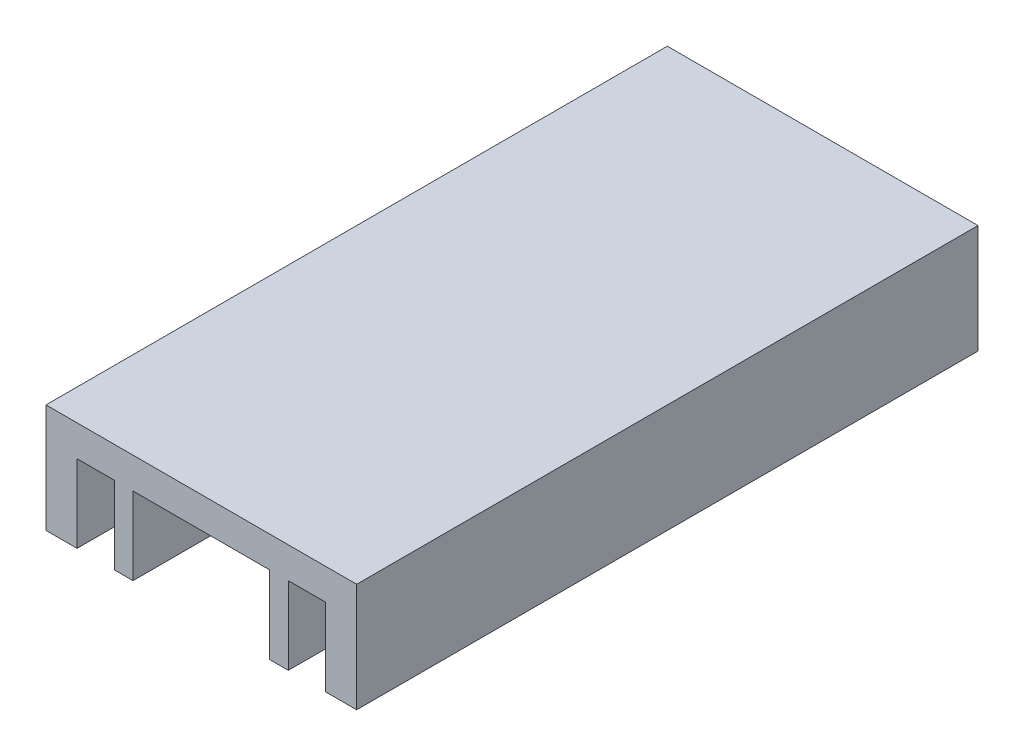
ISO-10303-21;
HEADER;
FILE_DESCRIPTION(('STEP AP214'),'2;1');
FILE_NAME('part.step','',(''),(''),'','','');
FILE_SCHEMA(('AUTOMOTIVE_DESIGN { 1 0 10303 214 1 1 1 1 }'));
ENDSEC;
DATA;
#1=APPLICATION_CONTEXT('core data for automotive mechanical design processes');
#2=APPLICATION_PROTOCOL_DEFINITION('international standard','automotive_design',2000,#1);
#3=PRODUCT_CONTEXT('',#1,'mechanical');
#4=PRODUCT('Part','Part','',(#3));
#5=PRODUCT_RELATED_PRODUCT_CATEGORY('part','',(#4));
#6=PRODUCT_DEFINITION_FORMATION('','',#4);
#7=PRODUCT_DEFINITION_CONTEXT('part definition',#1,'design');
#8=PRODUCT_DEFINITION('design','',#6,#7);
#9=PRODUCT_DEFINITION_SHAPE('','',#8);
#10=(LENGTH_UNIT() NAMED_UNIT(*) SI_UNIT(.MILLI.,.METRE.));
#11=(NAMED_UNIT(*) PLANE_ANGLE_UNIT() SI_UNIT($,.RADIAN.));
#12=(NAMED_UNIT(*) SI_UNIT($,.STERADIAN.) SOLID_ANGLE_UNIT());
#13=UNCERTAINTY_MEASURE_WITH_UNIT(LENGTH_MEASURE(1.E-05),#10,'distance_accuracy_value','');
#14=(GEOMETRIC_REPRESENTATION_CONTEXT(3) GLOBAL_UNCERTAINTY_ASSIGNED_CONTEXT((#13)) GLOBAL_UNIT_ASSIGNED_CONTEXT((#10,
#11,#12)) REPRESENTATION_CONTEXT('',''));
#15=CARTESIAN_POINT('',(0.,0.,0.));
#16=DIRECTION('',(0.,0.,1.));
#17=DIRECTION('',(1.,0.,0.));
#18=AXIS2_PLACEMENT_3D('',#15,#16,#17);
#19=CARTESIAN_POINT('',(-3.,6.5,20.));
#20=DIRECTION('',(-1.,0.,0.));
#21=DIRECTION('',(0.,0.,1.));
#22=AXIS2_PLACEMENT_3D('',#19,#20,#21);
#23=PLANE('',#22);
#24=DIRECTION('',(0.,1.,0.));
#25=VECTOR('',#24,1.);
#26=CARTESIAN_POINT('',(-3.,6.5,0.));
#27=LINE('',#26,#25);
#28=CARTESIAN_POINT('',(-3.,6.5,0.));
#29=VERTEX_POINT('',#28);
#30=CARTESIAN_POINT('',(-3.,9.,0.));
#31=VERTEX_POINT('',#30);
#32=EDGE_CURVE('E181',#29,#31,#27,.T.);
#33=ORIENTED_EDGE('',*,*,#32,.T.);
#34=DIRECTION('',(0.,0.,-1.));
#35=VECTOR('',#34,1.);
#36=CARTESIAN_POINT('',(-3.,9.,20.));
#37=LINE('',#36,#35);
#38=CARTESIAN_POINT('',(-3.,9.,20.));
#39=VERTEX_POINT('',#38);
#40=EDGE_CURVE('E11',#39,#31,#37,.T.);
#41=ORIENTED_EDGE('',*,*,#40,.F.);
#42=DIRECTION('',(0.,1.,0.));
#43=VECTOR('',#42,1.);
#44=CARTESIAN_POINT('',(-3.,6.5,20.));
#45=LINE('',#44,#43);
#46=CARTESIAN_POINT('',(-3.,6.5,20.));
#47=VERTEX_POINT('',#46);
#48=EDGE_CURVE('E211',#47,#39,#45,.T.);
#49=ORIENTED_EDGE('',*,*,#48,.F.);
#50=DIRECTION('',(0.,0.,-1.));
#51=VECTOR('',#50,1.);
#52=CARTESIAN_POINT('',(-3.,6.5,20.));
#53=LINE('',#52,#51);
#54=EDGE_CURVE('E177',#47,#29,#53,.T.);
#55=ORIENTED_EDGE('',*,*,#54,.T.);
#56=EDGE_LOOP('',(#33,#41,#49,#55));
#57=FACE_BOUND('',#56,.T.);
#58=ADVANCED_FACE('F37',(#57),#23,.F.);
#59=CARTESIAN_POINT('',(-3.,9.,20.));
#60=DIRECTION('',(0.,1.,0.));
#61=DIRECTION('',(0.,0.,1.));
#62=AXIS2_PLACEMENT_3D('',#59,#60,#61);
#63=PLANE('',#62);
#64=DIRECTION('',(1.,0.,0.));
#65=VECTOR('',#64,1.);
#66=CARTESIAN_POINT('',(-3.,9.,0.));
#67=LINE('',#66,#65);
#68=CARTESIAN_POINT('',(-1.8,9.,0.));
#69=VERTEX_POINT('',#68);
#70=EDGE_CURVE('E184',#31,#69,#67,.T.);
#71=ORIENTED_EDGE('',*,*,#70,.T.);
#72=DIRECTION('',(0.,0.,-1.));
#73=VECTOR('',#72,1.);
#74=CARTESIAN_POINT('',(-1.8,9.,20.));
#75=LINE('',#74,#73);
#76=CARTESIAN_POINT('',(-1.8,9.,20.));
#77=VERTEX_POINT('',#76);
#78=EDGE_CURVE('E45',#77,#69,#75,.T.);
#79=ORIENTED_EDGE('',*,*,#78,.F.);
#80=DIRECTION('',(1.,0.,0.));
#81=VECTOR('',#80,1.);
#82=CARTESIAN_POINT('',(-3.,9.,20.));
#83=LINE('',#82,#81);
#84=EDGE_CURVE('E120',#39,#77,#83,.T.);
#85=ORIENTED_EDGE('',*,*,#84,.F.);
#86=ORIENTED_EDGE('',*,*,#40,.T.);
#87=EDGE_LOOP('',(#71,#79,#85,#86));
#88=FACE_BOUND('',#87,.T.);
#89=ADVANCED_FACE('F309',(#88),#63,.F.);
#90=CARTESIAN_POINT('',(-1.8,9.,20.));
#91=DIRECTION('',(1.,0.,0.));
#92=DIRECTION('',(0.,1.,0.));
#93=AXIS2_PLACEMENT_3D('',#90,#91,#92);
#94=PLANE('',#93);
#95=DIRECTION('',(0.,-1.,0.));
#96=VECTOR('',#95,1.);
#97=CARTESIAN_POINT('',(-1.8,9.,0.));
#98=LINE('',#97,#96);
#99=CARTESIAN_POINT('',(-1.8,6.5,0.));
#100=VERTEX_POINT('',#99);
#101=EDGE_CURVE('E186',#69,#100,#98,.T.);
#102=ORIENTED_EDGE('',*,*,#101,.T.);
#103=DIRECTION('',(0.,0.,-1.));
#104=VECTOR('',#103,1.);
#105=CARTESIAN_POINT('',(-1.8,6.5,20.));
#106=LINE('',#105,#104);
#107=CARTESIAN_POINT('',(-1.8,6.5,20.));
#108=VERTEX_POINT('',#107);
#109=EDGE_CURVE('E242',#108,#100,#106,.T.);
#110=ORIENTED_EDGE('',*,*,#109,.F.);
#111=DIRECTION('',(0.,-1.,0.));
#112=VECTOR('',#111,1.);
#113=CARTESIAN_POINT('',(-1.8,9.,20.));
#114=LINE('',#113,#112);
#115=EDGE_CURVE('E250',#77,#108,#114,.T.);
#116=ORIENTED_EDGE('',*,*,#115,.F.);
#117=ORIENTED_EDGE('',*,*,#78,.T.);
#118=EDGE_LOOP('',(#102,#110,#116,#117));
#119=FACE_BOUND('',#118,.T.);
#120=ADVANCED_FACE('F248',(#119),#94,.F.);
#121=CARTESIAN_POINT('',(-1.8,6.5,20.));
#122=DIRECTION('',(0.,1.,0.));
#123=DIRECTION('',(0.,0.,1.));
#124=AXIS2_PLACEMENT_3D('',#121,#122,#123);
#125=PLANE('',#124);
#126=DIRECTION('',(1.,0.,0.));
#127=VECTOR('',#126,1.);
#128=CARTESIAN_POINT('',(-1.8,6.5,0.));
#129=LINE('',#128,#127);
#130=CARTESIAN_POINT('',(-1.2,6.5,0.));
#131=VERTEX_POINT('',#130);
#132=EDGE_CURVE('E188',#100,#131,#129,.T.);
#133=ORIENTED_EDGE('',*,*,#132,.T.);
#134=DIRECTION('',(0.,0.,-1.));
#135=VECTOR('',#134,1.);
#136=CARTESIAN_POINT('',(-1.2,6.5,20.));
#137=LINE('',#136,#135);
#138=CARTESIAN_POINT('',(-1.2,6.5,20.));
#139=VERTEX_POINT('',#138);
#140=EDGE_CURVE('E239',#139,#131,#137,.T.);
#141=ORIENTED_EDGE('',*,*,#140,.F.);
#142=DIRECTION('',(1.,0.,0.));
#143=VECTOR('',#142,1.);
#144=CARTESIAN_POINT('',(-1.8,6.5,20.));
#145=LINE('',#144,#143);
#146=EDGE_CURVE('E268',#108,#139,#145,.T.);
#147=ORIENTED_EDGE('',*,*,#146,.F.);
#148=ORIENTED_EDGE('',*,*,#109,.T.);
#149=EDGE_LOOP('',(#133,#141,#147,#148));
#150=FACE_BOUND('',#149,.T.);
#151=ADVANCED_FACE('F259',(#150),#125,.F.);
#152=CARTESIAN_POINT('',(-1.2,6.5,20.));
#153=DIRECTION('',(-1.,0.,0.));
#154=DIRECTION('',(0.,0.,1.));
#155=AXIS2_PLACEMENT_3D('',#152,#153,#154);
#156=PLANE('',#155);
#157=DIRECTION('',(0.,1.,0.));
#158=VECTOR('',#157,1.);
#159=CARTESIAN_POINT('',(-1.2,6.5,0.));
#160=LINE('',#159,#158);
#161=CARTESIAN_POINT('',(-1.2,9.,0.));
#162=VERTEX_POINT('',#161);
#163=EDGE_CURVE('E190',#131,#162,#160,.T.);
#164=ORIENTED_EDGE('',*,*,#163,.T.);
#165=DIRECTION('',(0.,0.,-1.));
#166=VECTOR('',#165,1.);
#167=CARTESIAN_POINT('',(-1.2,9.,20.));
#168=LINE('',#167,#166);
#169=CARTESIAN_POINT('',(-1.2,9.,20.));
#170=VERTEX_POINT('',#169);
#171=EDGE_CURVE('E236',#170,#162,#168,.T.);
#172=ORIENTED_EDGE('',*,*,#171,.F.);
#173=DIRECTION('',(0.,1.,0.));
#174=VECTOR('',#173,1.);
#175=CARTESIAN_POINT('',(-1.2,6.5,20.));
#176=LINE('',#175,#174);
#177=EDGE_CURVE('E265',#139,#170,#176,.T.);
#178=ORIENTED_EDGE('',*,*,#177,.F.);
#179=ORIENTED_EDGE('',*,*,#140,.T.);
#180=EDGE_LOOP('',(#164,#172,#178,#179));
#181=FACE_BOUND('',#180,.T.);
#182=ADVANCED_FACE('F263',(#181),#156,.F.);
#183=CARTESIAN_POINT('',(-1.2,9.,20.));
#184=DIRECTION('',(0.,1.,0.));
#185=DIRECTION('',(0.,0.,1.));
#186=AXIS2_PLACEMENT_3D('',#183,#184,#185);
#187=PLANE('',#186);
#188=DIRECTION('',(1.,0.,0.));
#189=VECTOR('',#188,1.);
#190=CARTESIAN_POINT('',(-1.2,9.,0.));
#191=LINE('',#190,#189);
#192=CARTESIAN_POINT('',(3.2,9.,0.));
#193=VERTEX_POINT('',#192);
#194=EDGE_CURVE('E192',#162,#193,#191,.T.);
#195=ORIENTED_EDGE('',*,*,#194,.T.);
#196=DIRECTION('',(0.,0.,-1.));
#197=VECTOR('',#196,1.);
#198=CARTESIAN_POINT('',(3.2,9.,20.));
#199=LINE('',#198,#197);
#200=CARTESIAN_POINT('',(3.2,9.,20.));
#201=VERTEX_POINT('',#200);
#202=EDGE_CURVE('E233',#201,#193,#199,.T.);
#203=ORIENTED_EDGE('',*,*,#202,.F.);
#204=DIRECTION('',(1.,0.,0.));
#205=VECTOR('',#204,1.);
#206=CARTESIAN_POINT('',(-1.2,9.,20.));
#207=LINE('',#206,#205);
#208=EDGE_CURVE('E267',#170,#201,#207,.T.);
#209=ORIENTED_EDGE('',*,*,#208,.F.);
#210=ORIENTED_EDGE('',*,*,#171,.T.);
#211=EDGE_LOOP('',(#195,#203,#209,#210));
#212=FACE_BOUND('',#211,.T.);
#213=ADVANCED_FACE('F322',(#212),#187,.F.);
#214=CARTESIAN_POINT('',(3.2,9.,20.));
#215=DIRECTION('',(1.,0.,0.));
#216=DIRECTION('',(0.,1.,0.));
#217=AXIS2_PLACEMENT_3D('',#214,#215,#216);
#218=PLANE('',#217);
#219=DIRECTION('',(0.,-1.,0.));
#220=VECTOR('',#219,1.);
#221=CARTESIAN_POINT('',(3.2,9.,0.));
#222=LINE('',#221,#220);
#223=CARTESIAN_POINT('',(3.2,6.5,0.));
#224=VERTEX_POINT('',#223);
#225=EDGE_CURVE('E194',#193,#224,#222,.T.);
#226=ORIENTED_EDGE('',*,*,#225,.T.);
#227=DIRECTION('',(0.,0.,-1.));
#228=VECTOR('',#227,1.);
#229=CARTESIAN_POINT('',(3.2,6.5,20.));
#230=LINE('',#229,#228);
#231=CARTESIAN_POINT('',(3.2,6.5,20.));
#232=VERTEX_POINT('',#231);
#233=EDGE_CURVE('E230',#232,#224,#230,.T.);
#234=ORIENTED_EDGE('',*,*,#233,.F.);
#235=DIRECTION('',(0.,-1.,0.));
#236=VECTOR('',#235,1.);
#237=CARTESIAN_POINT('',(3.2,9.,20.));
#238=LINE('',#237,#236);
#239=EDGE_CURVE('E270',#201,#232,#238,.T.);
#240=ORIENTED_EDGE('',*,*,#239,.F.);
#241=ORIENTED_EDGE('',*,*,#202,.T.);
#242=EDGE_LOOP('',(#226,#234,#240,#241));
#243=FACE_BOUND('',#242,.T.);
#244=ADVANCED_FACE('F325',(#243),#218,.F.);
#245=CARTESIAN_POINT('',(3.2,6.5,20.));
#246=DIRECTION('',(0.,1.,0.));
#247=DIRECTION('',(0.,0.,1.));
#248=AXIS2_PLACEMENT_3D('',#245,#246,#247);
#249=PLANE('',#248);
#250=DIRECTION('',(1.,0.,0.));
#251=VECTOR('',#250,1.);
#252=CARTESIAN_POINT('',(3.2,6.5,0.));
#253=LINE('',#252,#251);
#254=CARTESIAN_POINT('',(3.8,6.5,0.));
#255=VERTEX_POINT('',#254);
#256=EDGE_CURVE('E196',#224,#255,#253,.T.);
#257=ORIENTED_EDGE('',*,*,#256,.T.);
#258=DIRECTION('',(0.,0.,-1.));
#259=VECTOR('',#258,1.);
#260=CARTESIAN_POINT('',(3.8,6.5,20.));
#261=LINE('',#260,#259);
#262=CARTESIAN_POINT('',(3.8,6.5,20.));
#263=VERTEX_POINT('',#262);
#264=EDGE_CURVE('E227',#263,#255,#261,.T.);
#265=ORIENTED_EDGE('',*,*,#264,.F.);
#266=DIRECTION('',(1.,0.,0.));
#267=VECTOR('',#266,1.);
#268=CARTESIAN_POINT('',(3.2,6.5,20.));
#269=LINE('',#268,#267);
#270=EDGE_CURVE('E276',#232,#263,#269,.T.);
#271=ORIENTED_EDGE('',*,*,#270,.F.);
#272=ORIENTED_EDGE('',*,*,#233,.T.);
#273=EDGE_LOOP('',(#257,#265,#271,#272));
#274=FACE_BOUND('',#273,.T.);
#275=ADVANCED_FACE('F329',(#274),#249,.F.);
#276=CARTESIAN_POINT('',(3.8,6.5,20.));
#277=DIRECTION('',(-1.,0.,0.));
#278=DIRECTION('',(0.,0.,1.));
#279=AXIS2_PLACEMENT_3D('',#276,#277,#278);
#280=PLANE('',#279);
#281=DIRECTION('',(0.,1.,0.));
#282=VECTOR('',#281,1.);
#283=CARTESIAN_POINT('',(3.8,6.5,0.));
#284=LINE('',#283,#282);
#285=CARTESIAN_POINT('',(3.8,9.,0.));
#286=VERTEX_POINT('',#285);
#287=EDGE_CURVE('E198',#255,#286,#284,.T.);
#288=ORIENTED_EDGE('',*,*,#287,.T.);
#289=DIRECTION('',(0.,0.,-1.));
#290=VECTOR('',#289,1.);
#291=CARTESIAN_POINT('',(3.8,9.,20.));
#292=LINE('',#291,#290);
#293=CARTESIAN_POINT('',(3.8,9.,20.));
#294=VERTEX_POINT('',#293);
#295=EDGE_CURVE('E224',#294,#286,#292,.T.);
#296=ORIENTED_EDGE('',*,*,#295,.F.);
#297=DIRECTION('',(0.,1.,0.));
#298=VECTOR('',#297,1.);
#299=CARTESIAN_POINT('',(3.8,6.5,20.));
#300=LINE('',#299,#298);
#301=EDGE_CURVE('E278',#263,#294,#300,.T.);
#302=ORIENTED_EDGE('',*,*,#301,.F.);
#303=ORIENTED_EDGE('',*,*,#264,.T.);
#304=EDGE_LOOP('',(#288,#296,#302,#303));
#305=FACE_BOUND('',#304,.T.);
#306=ADVANCED_FACE('F333',(#305),#280,.F.);
#307=CARTESIAN_POINT('',(3.8,9.,20.));
#308=DIRECTION('',(0.,1.,0.));
#309=DIRECTION('',(0.,0.,1.));
#310=AXIS2_PLACEMENT_3D('',#307,#308,#309);
#311=PLANE('',#310);
#312=DIRECTION('',(1.,0.,0.));
#313=VECTOR('',#312,1.);
#314=CARTESIAN_POINT('',(3.8,9.,0.));
#315=LINE('',#314,#313);
#316=CARTESIAN_POINT('',(5.,9.,0.));
#317=VERTEX_POINT('',#316);
#318=EDGE_CURVE('E200',#286,#317,#315,.T.);
#319=ORIENTED_EDGE('',*,*,#318,.T.);
#320=DIRECTION('',(0.,0.,-1.));
#321=VECTOR('',#320,1.);
#322=CARTESIAN_POINT('',(5.,9.,20.));
#323=LINE('',#322,#321);
#324=CARTESIAN_POINT('',(5.,9.,20.));
#325=VERTEX_POINT('',#324);
#326=EDGE_CURVE('E221',#325,#317,#323,.T.);
#327=ORIENTED_EDGE('',*,*,#326,.F.);
#328=DIRECTION('',(1.,0.,0.));
#329=VECTOR('',#328,1.);
#330=CARTESIAN_POINT('',(3.8,9.,20.));
#331=LINE('',#330,#329);
#332=EDGE_CURVE('E280',#294,#325,#331,.T.);
#333=ORIENTED_EDGE('',*,*,#332,.F.);
#334=ORIENTED_EDGE('',*,*,#295,.T.);
#335=EDGE_LOOP('',(#319,#327,#333,#334));
#336=FACE_BOUND('',#335,.T.);
#337=ADVANCED_FACE('F337',(#336),#311,.F.);
#338=CARTESIAN_POINT('',(5.,6.5,20.));
#339=DIRECTION('',(1.,0.,0.));
#340=DIRECTION('',(0.,0.,-1.));
#341=AXIS2_PLACEMENT_3D('',#338,#339,#340);
#342=PLANE('',#341);
#343=DIRECTION('',(0.,-1.,0.));
#344=VECTOR('',#343,1.);
#345=CARTESIAN_POINT('',(5.,6.5,0.));
#346=LINE('',#345,#344);
#347=CARTESIAN_POINT('',(5.,6.5,0.));
#348=VERTEX_POINT('',#347);
#349=EDGE_CURVE('E202',#317,#348,#346,.T.);
#350=ORIENTED_EDGE('',*,*,#349,.T.);
#351=DIRECTION('',(0.,0.,-1.));
#352=VECTOR('',#351,1.);
#353=CARTESIAN_POINT('',(5.,6.5,20.));
#354=LINE('',#353,#352);
#355=CARTESIAN_POINT('',(5.,6.5,20.));
#356=VERTEX_POINT('',#355);
#357=EDGE_CURVE('E218',#356,#348,#354,.T.);
#358=ORIENTED_EDGE('',*,*,#357,.F.);
#359=DIRECTION('',(0.,-1.,0.));
#360=VECTOR('',#359,1.);
#361=CARTESIAN_POINT('',(5.,6.5,20.));
#362=LINE('',#361,#360);
#363=EDGE_CURVE('E282',#325,#356,#362,.T.);
#364=ORIENTED_EDGE('',*,*,#363,.F.);
#365=ORIENTED_EDGE('',*,*,#326,.T.);
#366=EDGE_LOOP('',(#350,#358,#364,#365));
#367=FACE_BOUND('',#366,.T.);
#368=ADVANCED_FACE('F341',(#367),#342,.F.);
#369=CARTESIAN_POINT('',(6.,6.5,20.));
#370=DIRECTION('',(0.,1.,0.));
#371=DIRECTION('',(-1.,0.,0.));
#372=AXIS2_PLACEMENT_3D('',#369,#370,#371);
#373=PLANE('',#372);
#374=DIRECTION('',(1.,0.,0.));
#375=VECTOR('',#374,1.);
#376=CARTESIAN_POINT('',(6.,6.5,0.));
#377=LINE('',#376,#375);
#378=CARTESIAN_POINT('',(6.,6.5,0.));
#379=VERTEX_POINT('',#378);
#380=EDGE_CURVE('E204',#348,#379,#377,.T.);
#381=ORIENTED_EDGE('',*,*,#380,.T.);
#382=DIRECTION('',(0.,0.,-1.));
#383=VECTOR('',#382,1.);
#384=CARTESIAN_POINT('',(6.,6.5,20.));
#385=LINE('',#384,#383);
#386=CARTESIAN_POINT('',(6.,6.5,20.));
#387=VERTEX_POINT('',#386);
#388=EDGE_CURVE('E215',#387,#379,#385,.T.);
#389=ORIENTED_EDGE('',*,*,#388,.F.);
#390=DIRECTION('',(1.,0.,0.));
#391=VECTOR('',#390,1.);
#392=CARTESIAN_POINT('',(6.,6.5,20.));
#393=LINE('',#392,#391);
#394=EDGE_CURVE('E284',#356,#387,#393,.T.);
#395=ORIENTED_EDGE('',*,*,#394,.F.);
#396=ORIENTED_EDGE('',*,*,#357,.T.);
#397=EDGE_LOOP('',(#381,#389,#395,#396));
#398=FACE_BOUND('',#397,.T.);
#399=ADVANCED_FACE('F290',(#398),#373,.F.);
#400=CARTESIAN_POINT('',(6.,10.,20.));
#401=DIRECTION('',(-1.,0.,0.));
#402=DIRECTION('',(0.,0.,1.));
#403=AXIS2_PLACEMENT_3D('',#400,#401,#402);
#404=PLANE('',#403);
#405=DIRECTION('',(0.,1.,0.));
#406=VECTOR('',#405,1.);
#407=CARTESIAN_POINT('',(6.,10.,0.));
#408=LINE('',#407,#406);
#409=CARTESIAN_POINT('',(6.,10.,0.));
#410=VERTEX_POINT('',#409);
#411=EDGE_CURVE('E206',#379,#410,#408,.T.);
#412=ORIENTED_EDGE('',*,*,#411,.T.);
#413=DIRECTION('',(0.,0.,-1.));
#414=VECTOR('',#413,1.);
#415=CARTESIAN_POINT('',(6.,10.,20.));
#416=LINE('',#415,#414);
#417=CARTESIAN_POINT('',(6.,10.,20.));
#418=VERTEX_POINT('',#417);
#419=EDGE_CURVE('E172',#418,#410,#416,.T.);
#420=ORIENTED_EDGE('',*,*,#419,.F.);
#421=DIRECTION('',(0.,1.,0.));
#422=VECTOR('',#421,1.);
#423=CARTESIAN_POINT('',(6.,10.,20.));
#424=LINE('',#423,#422);
#425=EDGE_CURVE('E163',#387,#418,#424,.T.);
#426=ORIENTED_EDGE('',*,*,#425,.F.);
#427=ORIENTED_EDGE('',*,*,#388,.T.);
#428=EDGE_LOOP('',(#412,#420,#426,#427));
#429=FACE_BOUND('',#428,.T.);
#430=ADVANCED_FACE('F294',(#429),#404,.F.);
#431=CARTESIAN_POINT('',(-4.,10.,20.));
#432=DIRECTION('',(0.,-1.,0.));
#433=DIRECTION('',(0.,0.,-1.));
#434=AXIS2_PLACEMENT_3D('',#431,#432,#433);
#435=PLANE('',#434);
#436=DIRECTION('',(-1.,0.,0.));
#437=VECTOR('',#436,1.);
#438=CARTESIAN_POINT('',(-4.,10.,0.));
#439=LINE('',#438,#437);
#440=CARTESIAN_POINT('',(-4.,10.,0.));
#441=VERTEX_POINT('',#440);
#442=EDGE_CURVE('E171',#410,#441,#439,.T.);
#443=ORIENTED_EDGE('',*,*,#442,.T.);
#444=DIRECTION('',(0.,0.,-1.));
#445=VECTOR('',#444,1.);
#446=CARTESIAN_POINT('',(-4.,10.,20.));
#447=LINE('',#446,#445);
#448=CARTESIAN_POINT('',(-4.,10.,20.));
#449=VERTEX_POINT('',#448);
#450=EDGE_CURVE('E168',#449,#441,#447,.T.);
#451=ORIENTED_EDGE('',*,*,#450,.F.);
#452=DIRECTION('',(-1.,0.,0.));
#453=VECTOR('',#452,1.);
#454=CARTESIAN_POINT('',(-4.,10.,20.));
#455=LINE('',#454,#453);
#456=EDGE_CURVE('E157',#418,#449,#455,.T.);
#457=ORIENTED_EDGE('',*,*,#456,.F.);
#458=ORIENTED_EDGE('',*,*,#419,.T.);
#459=EDGE_LOOP('',(#443,#451,#457,#458));
#460=FACE_BOUND('',#459,.T.);
#461=ADVANCED_FACE('F169',(#460),#435,.F.);
#462=CARTESIAN_POINT('',(-4.,6.5,20.));
#463=DIRECTION('',(1.,0.,0.));
#464=DIRECTION('',(0.,0.,-1.));
#465=AXIS2_PLACEMENT_3D('',#462,#463,#464);
#466=PLANE('',#465);
#467=DIRECTION('',(0.,-1.,0.));
#468=VECTOR('',#467,1.);
#469=CARTESIAN_POINT('',(-4.,6.5,0.));
#470=LINE('',#469,#468);
#471=CARTESIAN_POINT('',(-4.,6.5,0.));
#472=VERTEX_POINT('',#471);
#473=EDGE_CURVE('E106',#441,#472,#470,.T.);
#474=ORIENTED_EDGE('',*,*,#473,.T.);
#475=DIRECTION('',(0.,0.,-1.));
#476=VECTOR('',#475,1.);
#477=CARTESIAN_POINT('',(-4.,6.5,20.));
#478=LINE('',#477,#476);
#479=CARTESIAN_POINT('',(-4.,6.5,20.));
#480=VERTEX_POINT('',#479);
#481=EDGE_CURVE('E173',#480,#472,#478,.T.);
#482=ORIENTED_EDGE('',*,*,#481,.F.);
#483=DIRECTION('',(0.,-1.,0.));
#484=VECTOR('',#483,1.);
#485=CARTESIAN_POINT('',(-4.,6.5,20.));
#486=LINE('',#485,#484);
#487=EDGE_CURVE('E161',#449,#480,#486,.T.);
#488=ORIENTED_EDGE('',*,*,#487,.F.);
#489=ORIENTED_EDGE('',*,*,#450,.T.);
#490=EDGE_LOOP('',(#474,#482,#488,#489));
#491=FACE_BOUND('',#490,.T.);
#492=ADVANCED_FACE('F175',(#491),#466,.F.);
#493=CARTESIAN_POINT('',(-3.,6.5,20.));
#494=DIRECTION('',(0.,1.,0.));
#495=DIRECTION('',(0.,0.,1.));
#496=AXIS2_PLACEMENT_3D('',#493,#494,#495);
#497=PLANE('',#496);
#498=DIRECTION('',(1.,0.,0.));
#499=VECTOR('',#498,1.);
#500=CARTESIAN_POINT('',(-3.,6.5,0.));
#501=LINE('',#500,#499);
#502=EDGE_CURVE('E112',#472,#29,#501,.T.);
#503=ORIENTED_EDGE('',*,*,#502,.T.);
#504=ORIENTED_EDGE('',*,*,#54,.F.);
#505=DIRECTION('',(1.,0.,0.));
#506=VECTOR('',#505,1.);
#507=CARTESIAN_POINT('',(-3.,6.5,20.));
#508=LINE('',#507,#506);
#509=EDGE_CURVE('E53',#480,#47,#508,.T.);
#510=ORIENTED_EDGE('',*,*,#509,.F.);
#511=ORIENTED_EDGE('',*,*,#481,.T.);
#512=EDGE_LOOP('',(#503,#504,#510,#511));
#513=FACE_BOUND('',#512,.T.);
#514=ADVANCED_FACE('F298',(#513),#497,.F.);
#515=CARTESIAN_POINT('',(0.,0.,20.));
#516=DIRECTION('',(0.,0.,-1.));
#517=DIRECTION('',(-1.,0.,0.));
#518=AXIS2_PLACEMENT_3D('',#515,#516,#517);
#519=PLANE('',#518);
#520=ORIENTED_EDGE('',*,*,#48,.T.);
#521=ORIENTED_EDGE('',*,*,#84,.T.);
#522=ORIENTED_EDGE('',*,*,#115,.T.);
#523=ORIENTED_EDGE('',*,*,#146,.T.);
#524=ORIENTED_EDGE('',*,*,#177,.T.);
#525=ORIENTED_EDGE('',*,*,#208,.T.);
#526=ORIENTED_EDGE('',*,*,#239,.T.);
#527=ORIENTED_EDGE('',*,*,#270,.T.);
#528=ORIENTED_EDGE('',*,*,#301,.T.);
#529=ORIENTED_EDGE('',*,*,#332,.T.);
#530=ORIENTED_EDGE('',*,*,#363,.T.);
#531=ORIENTED_EDGE('',*,*,#394,.T.);
#532=ORIENTED_EDGE('',*,*,#425,.T.);
#533=ORIENTED_EDGE('',*,*,#456,.T.);
#534=ORIENTED_EDGE('',*,*,#487,.T.);
#535=ORIENTED_EDGE('',*,*,#509,.T.);
#536=EDGE_LOOP('',(#520,#521,#522,#523,#524,#525,#526,#527,#528,#529,#530,#531,#532,#533,#534,#535));
#537=FACE_BOUND('',#536,.T.);
#538=ADVANCED_FACE('F159',(#537),#519,.F.);
#539=CARTESIAN_POINT('',(0.,0.,0.));
#540=DIRECTION('',(0.,0.,-1.));
#541=DIRECTION('',(-1.,0.,0.));
#542=AXIS2_PLACEMENT_3D('',#539,#540,#541);
#543=PLANE('',#542);
#544=ORIENTED_EDGE('',*,*,#32,.F.);
#545=ORIENTED_EDGE('',*,*,#502,.F.);
#546=ORIENTED_EDGE('',*,*,#473,.F.);
#547=ORIENTED_EDGE('',*,*,#442,.F.);
#548=ORIENTED_EDGE('',*,*,#411,.F.);
#549=ORIENTED_EDGE('',*,*,#380,.F.);
#550=ORIENTED_EDGE('',*,*,#349,.F.);
#551=ORIENTED_EDGE('',*,*,#318,.F.);
#552=ORIENTED_EDGE('',*,*,#287,.F.);
#553=ORIENTED_EDGE('',*,*,#256,.F.);
#554=ORIENTED_EDGE('',*,*,#225,.F.);
#555=ORIENTED_EDGE('',*,*,#194,.F.);
#556=ORIENTED_EDGE('',*,*,#163,.F.);
#557=ORIENTED_EDGE('',*,*,#132,.F.);
#558=ORIENTED_EDGE('',*,*,#101,.F.);
#559=ORIENTED_EDGE('',*,*,#70,.F.);
#560=EDGE_LOOP('',(#544,#545,#546,#547,#548,#549,#550,#551,#552,#553,#554,#555,#556,#557,#558,#559));
#561=FACE_BOUND('',#560,.T.);
#562=ADVANCED_FACE('F254',(#561),#543,.T.);
#563=CLOSED_SHELL('',(#58,#89,#120,#151,#182,#213,#244,#275,#306,#337,#368,#399,#430,#461,#492,
#514,#538,#562));
#564=MANIFOLD_SOLID_BREP('B2',#563);
#565=ADVANCED_BREP_SHAPE_REPRESENTATION('',(#18,#564),#14);
#566=SHAPE_DEFINITION_REPRESENTATION(#9,#565);
ENDSEC;
END-ISO-10303-21;
